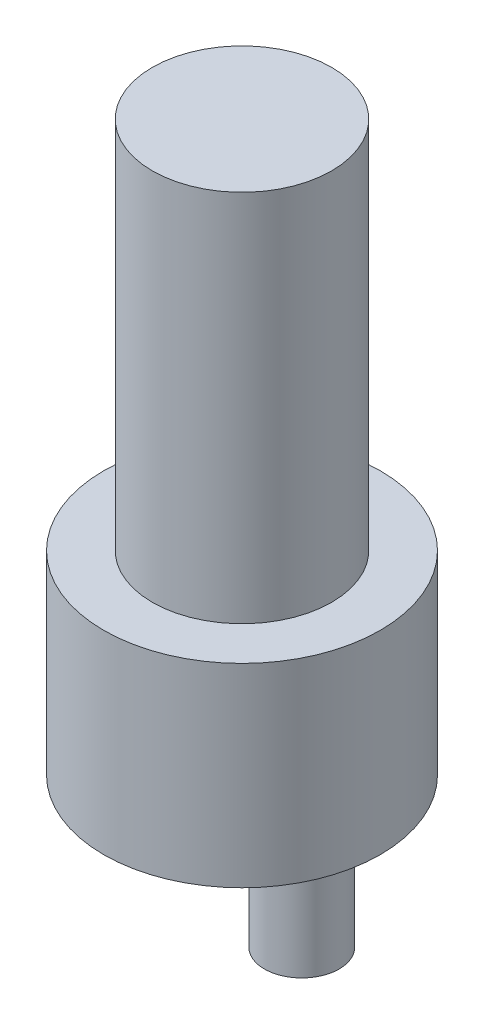
ISO-10303-21;
HEADER;
FILE_DESCRIPTION(('STEP AP214'),'2;1');
FILE_NAME('part.step','',(''),(''),'','','');
FILE_SCHEMA(('AUTOMOTIVE_DESIGN { 1 0 10303 214 1 1 1 1 }'));
ENDSEC;
DATA;
#1=APPLICATION_CONTEXT('core data for automotive mechanical design processes');
#2=APPLICATION_PROTOCOL_DEFINITION('international standard','automotive_design',2000,#1);
#3=PRODUCT_CONTEXT('',#1,'mechanical');
#4=PRODUCT('Part','Part','',(#3));
#5=PRODUCT_RELATED_PRODUCT_CATEGORY('part','',(#4));
#6=PRODUCT_DEFINITION_FORMATION('','',#4);
#7=PRODUCT_DEFINITION_CONTEXT('part definition',#1,'design');
#8=PRODUCT_DEFINITION('design','',#6,#7);
#9=PRODUCT_DEFINITION_SHAPE('','',#8);
#10=(LENGTH_UNIT() NAMED_UNIT(*) SI_UNIT(.MILLI.,.METRE.));
#11=(NAMED_UNIT(*) PLANE_ANGLE_UNIT() SI_UNIT($,.RADIAN.));
#12=(NAMED_UNIT(*) SI_UNIT($,.STERADIAN.) SOLID_ANGLE_UNIT());
#13=UNCERTAINTY_MEASURE_WITH_UNIT(LENGTH_MEASURE(1.E-05),#10,'distance_accuracy_value','');
#14=(GEOMETRIC_REPRESENTATION_CONTEXT(3) GLOBAL_UNCERTAINTY_ASSIGNED_CONTEXT((#13)) GLOBAL_UNIT_ASSIGNED_CONTEXT((#10,
#11,#12)) REPRESENTATION_CONTEXT('',''));
#15=CARTESIAN_POINT('',(0.,0.,0.));
#16=DIRECTION('',(0.,0.,1.));
#17=DIRECTION('',(1.,0.,0.));
#18=AXIS2_PLACEMENT_3D('',#15,#16,#17);
#19=CARTESIAN_POINT('',(0.,100.,0.));
#20=DIRECTION('',(0.,-1.,0.));
#21=DIRECTION('',(0.,0.,-1.));
#22=AXIS2_PLACEMENT_3D('',#19,#20,#21);
#23=CYLINDRICAL_SURFACE('',#22,18.5);
#24=CARTESIAN_POINT('',(0.,50.,0.));
#25=DIRECTION('',(0.,1.,0.));
#26=DIRECTION('',(0.,0.,1.));
#27=AXIS2_PLACEMENT_3D('',#24,#25,#26);
#28=CIRCLE('',#27,18.5);
#29=CARTESIAN_POINT('',(0.,50.,18.5));
#30=VERTEX_POINT('',#29);
#31=EDGE_CURVE('E11',#30,#30,#28,.T.);
#32=ORIENTED_EDGE('',*,*,#31,.F.);
#33=EDGE_LOOP('',(#32));
#34=FACE_BOUND('',#33,.T.);
#35=CARTESIAN_POINT('',(0.,24.,0.));
#36=DIRECTION('',(0.,-1.,0.));
#37=DIRECTION('',(0.,0.,-1.));
#38=AXIS2_PLACEMENT_3D('',#35,#36,#37);
#39=CIRCLE('',#38,18.5);
#40=CARTESIAN_POINT('',(0.,24.,-18.5));
#41=VERTEX_POINT('',#40);
#42=EDGE_CURVE('E61',#41,#41,#39,.T.);
#43=ORIENTED_EDGE('',*,*,#42,.F.);
#44=EDGE_LOOP('',(#43));
#45=FACE_BOUND('',#44,.T.);
#46=ADVANCED_FACE('F43',(#34,#45),#23,.T.);
#47=CARTESIAN_POINT('',(0.,50.,0.));
#48=DIRECTION('',(0.,1.,0.));
#49=DIRECTION('',(0.,0.,1.));
#50=AXIS2_PLACEMENT_3D('',#47,#48,#49);
#51=PLANE('',#50);
#52=CARTESIAN_POINT('',(0.,50.,0.));
#53=DIRECTION('',(0.,1.,0.));
#54=DIRECTION('',(0.,0.,1.));
#55=AXIS2_PLACEMENT_3D('',#52,#53,#54);
#56=CIRCLE('',#55,12.);
#57=CARTESIAN_POINT('',(0.,50.,12.));
#58=VERTEX_POINT('',#57);
#59=EDGE_CURVE('E50',#58,#58,#56,.T.);
#60=ORIENTED_EDGE('',*,*,#59,.F.);
#61=EDGE_LOOP('',(#60));
#62=FACE_BOUND('',#61,.T.);
#63=ORIENTED_EDGE('',*,*,#31,.T.);
#64=EDGE_LOOP('',(#63));
#65=FACE_BOUND('',#64,.T.);
#66=ADVANCED_FACE('F86',(#62,#65),#51,.T.);
#67=CARTESIAN_POINT('',(0.,50.,0.));
#68=DIRECTION('',(0.,1.,0.));
#69=DIRECTION('',(0.,0.,1.));
#70=AXIS2_PLACEMENT_3D('',#67,#68,#69);
#71=CYLINDRICAL_SURFACE('',#70,12.);
#72=ORIENTED_EDGE('',*,*,#59,.T.);
#73=EDGE_LOOP('',(#72));
#74=FACE_BOUND('',#73,.T.);
#75=CARTESIAN_POINT('',(0.,100.,0.));
#76=DIRECTION('',(0.,1.,0.));
#77=DIRECTION('',(0.,0.,1.));
#78=AXIS2_PLACEMENT_3D('',#75,#76,#77);
#79=CIRCLE('',#78,12.);
#80=CARTESIAN_POINT('',(0.,100.,12.));
#81=VERTEX_POINT('',#80);
#82=EDGE_CURVE('E55',#81,#81,#79,.T.);
#83=ORIENTED_EDGE('',*,*,#82,.F.);
#84=EDGE_LOOP('',(#83));
#85=FACE_BOUND('',#84,.T.);
#86=ADVANCED_FACE('F91',(#74,#85),#71,.T.);
#87=CARTESIAN_POINT('',(0.,100.,0.));
#88=DIRECTION('',(0.,1.,0.));
#89=DIRECTION('',(0.,0.,1.));
#90=AXIS2_PLACEMENT_3D('',#87,#88,#89);
#91=PLANE('',#90);
#92=ORIENTED_EDGE('',*,*,#82,.T.);
#93=EDGE_LOOP('',(#92));
#94=FACE_BOUND('',#93,.T.);
#95=ADVANCED_FACE('F81',(#94),#91,.T.);
#96=CARTESIAN_POINT('',(0.,24.,0.));
#97=DIRECTION('',(0.,-1.,0.));
#98=DIRECTION('',(0.,0.,-1.));
#99=AXIS2_PLACEMENT_3D('',#96,#97,#98);
#100=PLANE('',#99);
#101=CARTESIAN_POINT('',(0.,24.,-8.));
#102=DIRECTION('',(0.,-1.,0.));
#103=DIRECTION('',(0.,0.,-1.));
#104=AXIS2_PLACEMENT_3D('',#101,#102,#103);
#105=CIRCLE('',#104,5.);
#106=CARTESIAN_POINT('',(0.,24.,-13.));
#107=VERTEX_POINT('',#106);
#108=EDGE_CURVE('E66',#107,#107,#105,.T.);
#109=ORIENTED_EDGE('',*,*,#108,.F.);
#110=EDGE_LOOP('',(#109));
#111=FACE_BOUND('',#110,.T.);
#112=ORIENTED_EDGE('',*,*,#42,.T.);
#113=EDGE_LOOP('',(#112));
#114=FACE_BOUND('',#113,.T.);
#115=ADVANCED_FACE('F78',(#111,#114),#100,.T.);
#116=CARTESIAN_POINT('',(0.,24.,-8.));
#117=DIRECTION('',(0.,-1.,0.));
#118=DIRECTION('',(0.,0.,-1.));
#119=AXIS2_PLACEMENT_3D('',#116,#117,#118);
#120=CYLINDRICAL_SURFACE('',#119,5.);
#121=ORIENTED_EDGE('',*,*,#108,.T.);
#122=EDGE_LOOP('',(#121));
#123=FACE_BOUND('',#122,.T.);
#124=CARTESIAN_POINT('',(0.,0.,-8.));
#125=DIRECTION('',(0.,-1.,0.));
#126=DIRECTION('',(0.,0.,-1.));
#127=AXIS2_PLACEMENT_3D('',#124,#125,#126);
#128=CIRCLE('',#127,5.);
#129=CARTESIAN_POINT('',(0.,0.,-13.));
#130=VERTEX_POINT('',#129);
#131=EDGE_CURVE('E67',#130,#130,#128,.T.);
#132=ORIENTED_EDGE('',*,*,#131,.F.);
#133=EDGE_LOOP('',(#132));
#134=FACE_BOUND('',#133,.T.);
#135=ADVANCED_FACE('F75',(#123,#134),#120,.T.);
#136=CARTESIAN_POINT('',(0.,0.,0.));
#137=DIRECTION('',(0.,1.,0.));
#138=DIRECTION('',(0.,0.,1.));
#139=AXIS2_PLACEMENT_3D('',#136,#137,#138);
#140=PLANE('',#139);
#141=ORIENTED_EDGE('',*,*,#131,.T.);
#142=EDGE_LOOP('',(#141));
#143=FACE_BOUND('',#142,.T.);
#144=ADVANCED_FACE('F101',(#143),#140,.F.);
#145=CLOSED_SHELL('',(#46,#66,#86,#95,#115,#135,#144));
#146=MANIFOLD_SOLID_BREP('B2',#145);
#147=ADVANCED_BREP_SHAPE_REPRESENTATION('',(#18,#146),#14);
#148=SHAPE_DEFINITION_REPRESENTATION(#9,#147);
ENDSEC;
END-ISO-10303-21;
